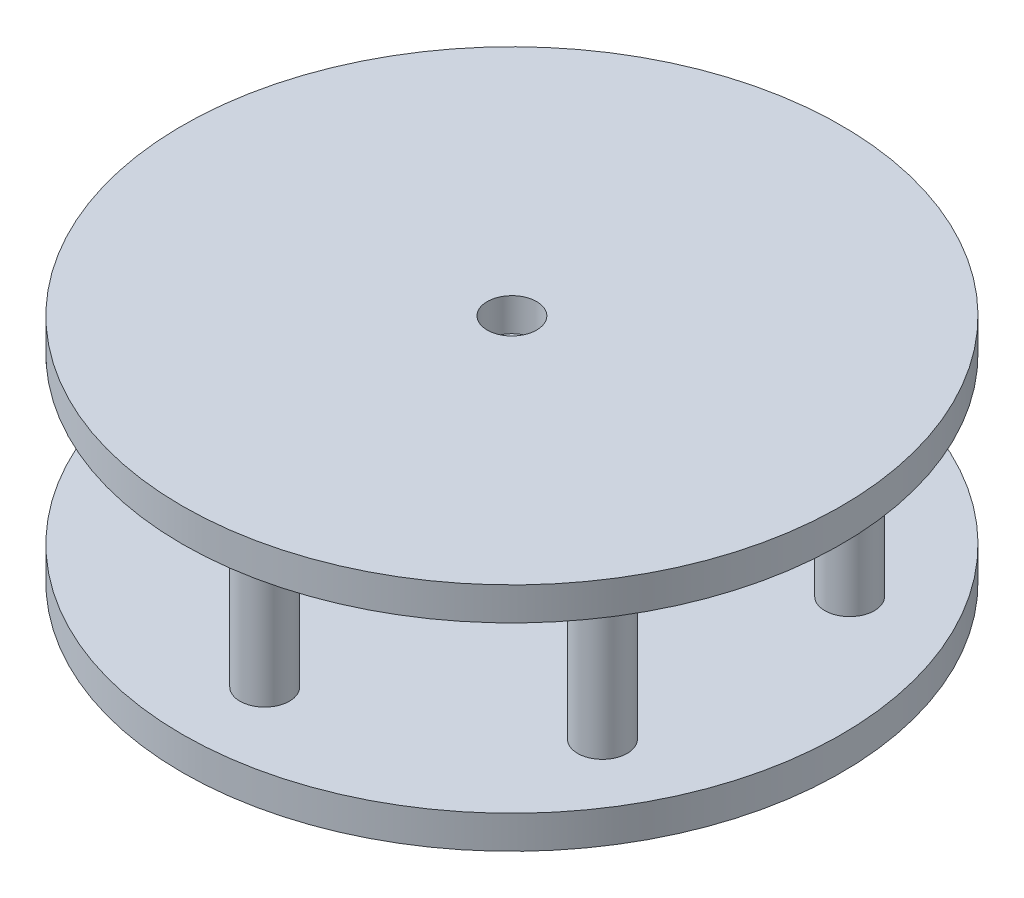
ISO-10303-21;
HEADER;
FILE_DESCRIPTION(('STEP AP214'),'2;1');
FILE_NAME('part.step','',(''),(''),'','','');
FILE_SCHEMA(('AUTOMOTIVE_DESIGN { 1 0 10303 214 1 1 1 1 }'));
ENDSEC;
DATA;
#1=APPLICATION_CONTEXT('core data for automotive mechanical design processes');
#2=APPLICATION_PROTOCOL_DEFINITION('international standard','automotive_design',2000,#1);
#3=PRODUCT_CONTEXT('',#1,'mechanical');
#4=PRODUCT('Part','Part','',(#3));
#5=PRODUCT_RELATED_PRODUCT_CATEGORY('part','',(#4));
#6=PRODUCT_DEFINITION_FORMATION('','',#4);
#7=PRODUCT_DEFINITION_CONTEXT('part definition',#1,'design');
#8=PRODUCT_DEFINITION('design','',#6,#7);
#9=PRODUCT_DEFINITION_SHAPE('','',#8);
#10=(LENGTH_UNIT() NAMED_UNIT(*) SI_UNIT(.MILLI.,.METRE.));
#11=(NAMED_UNIT(*) PLANE_ANGLE_UNIT() SI_UNIT($,.RADIAN.));
#12=(NAMED_UNIT(*) SI_UNIT($,.STERADIAN.) SOLID_ANGLE_UNIT());
#13=UNCERTAINTY_MEASURE_WITH_UNIT(LENGTH_MEASURE(1.E-05),#10,'distance_accuracy_value','');
#14=(GEOMETRIC_REPRESENTATION_CONTEXT(3) GLOBAL_UNCERTAINTY_ASSIGNED_CONTEXT((#13)) GLOBAL_UNIT_ASSIGNED_CONTEXT((#10,
#11,#12)) REPRESENTATION_CONTEXT('',''));
#15=CARTESIAN_POINT('',(0.,0.,0.));
#16=DIRECTION('',(0.,0.,1.));
#17=DIRECTION('',(1.,0.,0.));
#18=AXIS2_PLACEMENT_3D('',#15,#16,#17);
#19=CARTESIAN_POINT('',(0.,5.08000000000001,0.));
#20=DIRECTION('',(0.,-1.,0.));
#21=DIRECTION('',(0.,0.,-1.));
#22=AXIS2_PLACEMENT_3D('',#19,#20,#21);
#23=CYLINDRICAL_SURFACE('',#22,50.7895580678315);
#24=CARTESIAN_POINT('',(0.,5.08000000000001,0.));
#25=DIRECTION('',(0.,1.,0.));
#26=DIRECTION('',(0.,0.,1.));
#27=AXIS2_PLACEMENT_3D('',#24,#25,#26);
#28=CIRCLE('',#27,50.7895580678315);
#29=CARTESIAN_POINT('',(0.,5.08000000000001,50.7895580678315));
#30=VERTEX_POINT('',#29);
#31=EDGE_CURVE('E10',#30,#30,#28,.T.);
#32=ORIENTED_EDGE('',*,*,#31,.F.);
#33=EDGE_LOOP('',(#32));
#34=FACE_BOUND('',#33,.T.);
#35=CARTESIAN_POINT('',(0.,0.,0.));
#36=DIRECTION('',(0.,1.,0.));
#37=DIRECTION('',(0.,0.,1.));
#38=AXIS2_PLACEMENT_3D('',#35,#36,#37);
#39=CIRCLE('',#38,50.7895580678315);
#40=CARTESIAN_POINT('',(0.,0.,50.7895580678315));
#41=VERTEX_POINT('',#40);
#42=EDGE_CURVE('E40',#41,#41,#39,.T.);
#43=ORIENTED_EDGE('',*,*,#42,.T.);
#44=EDGE_LOOP('',(#43));
#45=FACE_BOUND('',#44,.T.);
#46=ADVANCED_FACE('F33',(#34,#45),#23,.T.);
#47=CARTESIAN_POINT('',(0.,5.08000000000001,0.));
#48=DIRECTION('',(0.,1.,0.));
#49=DIRECTION('',(0.,0.,1.));
#50=AXIS2_PLACEMENT_3D('',#47,#48,#49);
#51=PLANE('',#50);
#52=CARTESIAN_POINT('',(0.,5.08000000000001,0.));
#53=DIRECTION('',(0.,1.,0.));
#54=DIRECTION('',(0.,0.,1.));
#55=AXIS2_PLACEMENT_3D('',#52,#53,#54);
#56=CIRCLE('',#55,3.81);
#57=CARTESIAN_POINT('',(0.,5.08000000000001,3.81));
#58=VERTEX_POINT('',#57);
#59=EDGE_CURVE('E86',#58,#58,#56,.T.);
#60=ORIENTED_EDGE('',*,*,#59,.F.);
#61=EDGE_LOOP('',(#60));
#62=FACE_BOUND('',#61,.T.);
#63=CARTESIAN_POINT('',(32.995567884187,5.08000000000001,-19.0500000000003));
#64=DIRECTION('',(0.,1.,0.));
#65=DIRECTION('',(-0.866025403784435,0.,0.500000000000007));
#66=AXIS2_PLACEMENT_3D('',#63,#64,#65);
#67=CIRCLE('',#66,3.81373388663265);
#68=CARTESIAN_POINT('',(29.6927774550895,5.08000000000001,-17.1431330566839));
#69=VERTEX_POINT('',#68);
#70=EDGE_CURVE('E77',#69,#69,#67,.T.);
#71=ORIENTED_EDGE('',*,*,#70,.F.);
#72=EDGE_LOOP('',(#71));
#73=FACE_BOUND('',#72,.T.);
#74=CARTESIAN_POINT('',(32.9955678841872,5.08000000000001,19.0499999999998));
#75=DIRECTION('',(0.,1.,0.));
#76=DIRECTION('',(-0.866025403784442,0.,-0.499999999999994));
#77=AXIS2_PLACEMENT_3D('',#74,#75,#76);
#78=CIRCLE('',#77,3.81373388663265);
#79=CARTESIAN_POINT('',(29.6927774550898,5.08000000000001,17.1431330566835));
#80=VERTEX_POINT('',#79);
#81=EDGE_CURVE('E71',#80,#80,#78,.T.);
#82=ORIENTED_EDGE('',*,*,#81,.F.);
#83=EDGE_LOOP('',(#82));
#84=FACE_BOUND('',#83,.T.);
#85=CARTESIAN_POINT('',(1.98565732923109E-13,5.08000000000001,38.1));
#86=DIRECTION('',(0.,1.,0.));
#87=DIRECTION('',(0.,0.,-1.));
#88=AXIS2_PLACEMENT_3D('',#85,#86,#87);
#89=CIRCLE('',#88,3.81373388663265);
#90=CARTESIAN_POINT('',(1.78709123803299E-13,5.08000000000001,34.2862661133674));
#91=VERTEX_POINT('',#90);
#92=EDGE_CURVE('E65',#91,#91,#89,.T.);
#93=ORIENTED_EDGE('',*,*,#92,.F.);
#94=EDGE_LOOP('',(#93));
#95=FACE_BOUND('',#94,.T.);
#96=CARTESIAN_POINT('',(-32.9955678841871,5.08000000000001,19.0500000000001));
#97=DIRECTION('',(0.,1.,0.));
#98=DIRECTION('',(0.866025403784437,0.,-0.500000000000003));
#99=AXIS2_PLACEMENT_3D('',#96,#97,#98);
#100=CIRCLE('',#99,3.81373388663265);
#101=CARTESIAN_POINT('',(-29.6927774550896,5.08000000000001,17.1431330566838));
#102=VERTEX_POINT('',#101);
#103=EDGE_CURVE('E59',#102,#102,#100,.T.);
#104=ORIENTED_EDGE('',*,*,#103,.F.);
#105=EDGE_LOOP('',(#104));
#106=FACE_BOUND('',#105,.T.);
#107=CARTESIAN_POINT('',(-32.9955678841871,5.08000000000001,-19.0499999999999));
#108=DIRECTION('',(0.,1.,0.));
#109=DIRECTION('',(0.866025403784439,0.,0.499999999999999));
#110=AXIS2_PLACEMENT_3D('',#107,#108,#109);
#111=CIRCLE('',#110,3.81373388663265);
#112=CARTESIAN_POINT('',(-29.6927774550897,5.08000000000001,-17.1431330566836));
#113=VERTEX_POINT('',#112);
#114=EDGE_CURVE('E53',#113,#113,#111,.T.);
#115=ORIENTED_EDGE('',*,*,#114,.F.);
#116=EDGE_LOOP('',(#115));
#117=FACE_BOUND('',#116,.T.);
#118=CARTESIAN_POINT('',(0.,5.08000000000001,-38.1));
#119=DIRECTION('',(0.,1.,0.));
#120=DIRECTION('',(0.,0.,1.));
#121=AXIS2_PLACEMENT_3D('',#118,#119,#120);
#122=CIRCLE('',#121,3.81373388663265);
#123=CARTESIAN_POINT('',(0.,5.08000000000001,-34.2862661133674));
#124=VERTEX_POINT('',#123);
#125=EDGE_CURVE('E47',#124,#124,#122,.T.);
#126=ORIENTED_EDGE('',*,*,#125,.F.);
#127=EDGE_LOOP('',(#126));
#128=FACE_BOUND('',#127,.T.);
#129=ORIENTED_EDGE('',*,*,#31,.T.);
#130=EDGE_LOOP('',(#129));
#131=FACE_BOUND('',#130,.T.);
#132=ADVANCED_FACE('F118',(#62,#73,#84,#95,#106,#117,#128,#131),#51,.T.);
#133=CARTESIAN_POINT('',(0.,0.,0.));
#134=DIRECTION('',(0.,1.,0.));
#135=DIRECTION('',(0.,0.,1.));
#136=AXIS2_PLACEMENT_3D('',#133,#134,#135);
#137=PLANE('',#136);
#138=CARTESIAN_POINT('',(0.,0.,0.));
#139=DIRECTION('',(0.,1.,0.));
#140=DIRECTION('',(0.,0.,1.));
#141=AXIS2_PLACEMENT_3D('',#138,#139,#140);
#142=CIRCLE('',#141,3.81);
#143=CARTESIAN_POINT('',(0.,0.,3.81));
#144=VERTEX_POINT('',#143);
#145=EDGE_CURVE('E94',#144,#144,#142,.T.);
#146=ORIENTED_EDGE('',*,*,#145,.T.);
#147=EDGE_LOOP('',(#146));
#148=FACE_BOUND('',#147,.T.);
#149=ORIENTED_EDGE('',*,*,#42,.F.);
#150=EDGE_LOOP('',(#149));
#151=FACE_BOUND('',#150,.T.);
#152=ADVANCED_FACE('F123',(#148,#151),#137,.F.);
#153=CARTESIAN_POINT('',(0.,30.48,-38.1));
#154=DIRECTION('',(0.,-1.,0.));
#155=DIRECTION('',(0.,0.,-1.));
#156=AXIS2_PLACEMENT_3D('',#153,#154,#155);
#157=CYLINDRICAL_SURFACE('',#156,3.81373388663265);
#158=CARTESIAN_POINT('',(0.,30.48,-38.1));
#159=DIRECTION('',(0.,1.,0.));
#160=DIRECTION('',(0.,0.,1.));
#161=AXIS2_PLACEMENT_3D('',#158,#159,#160);
#162=CIRCLE('',#161,3.81373388663265);
#163=CARTESIAN_POINT('',(0.,30.48,-34.2862661133674));
#164=VERTEX_POINT('',#163);
#165=EDGE_CURVE('E45',#164,#164,#162,.T.);
#166=ORIENTED_EDGE('',*,*,#165,.F.);
#167=EDGE_LOOP('',(#166));
#168=FACE_BOUND('',#167,.T.);
#169=ORIENTED_EDGE('',*,*,#125,.T.);
#170=EDGE_LOOP('',(#169));
#171=FACE_BOUND('',#170,.T.);
#172=ADVANCED_FACE('F130',(#168,#171),#157,.T.);
#173=CARTESIAN_POINT('',(-32.9955678841871,30.48,-19.0499999999999));
#174=DIRECTION('',(0.,-1.,0.));
#175=DIRECTION('',(0.,0.,-1.));
#176=AXIS2_PLACEMENT_3D('',#173,#174,#175);
#177=CYLINDRICAL_SURFACE('',#176,3.81373388663265);
#178=CARTESIAN_POINT('',(-32.9955678841871,30.48,-19.0499999999999));
#179=DIRECTION('',(0.,1.,0.));
#180=DIRECTION('',(0.866025403784439,0.,0.499999999999999));
#181=AXIS2_PLACEMENT_3D('',#178,#179,#180);
#182=CIRCLE('',#181,3.81373388663265);
#183=CARTESIAN_POINT('',(-29.6927774550897,30.48,-17.1431330566836));
#184=VERTEX_POINT('',#183);
#185=EDGE_CURVE('E50',#184,#184,#182,.T.);
#186=ORIENTED_EDGE('',*,*,#185,.F.);
#187=EDGE_LOOP('',(#186));
#188=FACE_BOUND('',#187,.T.);
#189=ORIENTED_EDGE('',*,*,#114,.T.);
#190=EDGE_LOOP('',(#189));
#191=FACE_BOUND('',#190,.T.);
#192=ADVANCED_FACE('F134',(#188,#191),#177,.T.);
#193=CARTESIAN_POINT('',(-32.9955678841871,30.48,19.0500000000001));
#194=DIRECTION('',(0.,-1.,0.));
#195=DIRECTION('',(0.,0.,-1.));
#196=AXIS2_PLACEMENT_3D('',#193,#194,#195);
#197=CYLINDRICAL_SURFACE('',#196,3.81373388663265);
#198=CARTESIAN_POINT('',(-32.9955678841871,30.48,19.0500000000001));
#199=DIRECTION('',(0.,1.,0.));
#200=DIRECTION('',(0.866025403784437,0.,-0.500000000000003));
#201=AXIS2_PLACEMENT_3D('',#198,#199,#200);
#202=CIRCLE('',#201,3.81373388663265);
#203=CARTESIAN_POINT('',(-29.6927774550896,30.48,17.1431330566838));
#204=VERTEX_POINT('',#203);
#205=EDGE_CURVE('E56',#204,#204,#202,.T.);
#206=ORIENTED_EDGE('',*,*,#205,.F.);
#207=EDGE_LOOP('',(#206));
#208=FACE_BOUND('',#207,.T.);
#209=ORIENTED_EDGE('',*,*,#103,.T.);
#210=EDGE_LOOP('',(#209));
#211=FACE_BOUND('',#210,.T.);
#212=ADVANCED_FACE('F140',(#208,#211),#197,.T.);
#213=CARTESIAN_POINT('',(1.98565732923109E-13,30.48,38.1));
#214=DIRECTION('',(0.,-1.,0.));
#215=DIRECTION('',(0.,0.,-1.));
#216=AXIS2_PLACEMENT_3D('',#213,#214,#215);
#217=CYLINDRICAL_SURFACE('',#216,3.81373388663265);
#218=CARTESIAN_POINT('',(1.98565732923109E-13,30.48,38.1));
#219=DIRECTION('',(0.,1.,0.));
#220=DIRECTION('',(0.,0.,-1.));
#221=AXIS2_PLACEMENT_3D('',#218,#219,#220);
#222=CIRCLE('',#221,3.81373388663265);
#223=CARTESIAN_POINT('',(1.78709123803299E-13,30.48,34.2862661133674));
#224=VERTEX_POINT('',#223);
#225=EDGE_CURVE('E62',#224,#224,#222,.T.);
#226=ORIENTED_EDGE('',*,*,#225,.F.);
#227=EDGE_LOOP('',(#226));
#228=FACE_BOUND('',#227,.T.);
#229=ORIENTED_EDGE('',*,*,#92,.T.);
#230=EDGE_LOOP('',(#229));
#231=FACE_BOUND('',#230,.T.);
#232=ADVANCED_FACE('F144',(#228,#231),#217,.T.);
#233=CARTESIAN_POINT('',(32.9955678841872,30.48,19.0499999999998));
#234=DIRECTION('',(0.,-1.,0.));
#235=DIRECTION('',(0.,0.,-1.));
#236=AXIS2_PLACEMENT_3D('',#233,#234,#235);
#237=CYLINDRICAL_SURFACE('',#236,3.81373388663265);
#238=CARTESIAN_POINT('',(32.9955678841872,30.48,19.0499999999998));
#239=DIRECTION('',(0.,1.,0.));
#240=DIRECTION('',(-0.866025403784442,0.,-0.499999999999994));
#241=AXIS2_PLACEMENT_3D('',#238,#239,#240);
#242=CIRCLE('',#241,3.81373388663265);
#243=CARTESIAN_POINT('',(29.6927774550898,30.48,17.1431330566835));
#244=VERTEX_POINT('',#243);
#245=EDGE_CURVE('E68',#244,#244,#242,.T.);
#246=ORIENTED_EDGE('',*,*,#245,.F.);
#247=EDGE_LOOP('',(#246));
#248=FACE_BOUND('',#247,.T.);
#249=ORIENTED_EDGE('',*,*,#81,.T.);
#250=EDGE_LOOP('',(#249));
#251=FACE_BOUND('',#250,.T.);
#252=ADVANCED_FACE('F148',(#248,#251),#237,.T.);
#253=CARTESIAN_POINT('',(32.995567884187,30.48,-19.0500000000003));
#254=DIRECTION('',(0.,-1.,0.));
#255=DIRECTION('',(0.,0.,-1.));
#256=AXIS2_PLACEMENT_3D('',#253,#254,#255);
#257=CYLINDRICAL_SURFACE('',#256,3.81373388663265);
#258=CARTESIAN_POINT('',(32.995567884187,30.48,-19.0500000000003));
#259=DIRECTION('',(0.,1.,0.));
#260=DIRECTION('',(-0.866025403784435,0.,0.500000000000007));
#261=AXIS2_PLACEMENT_3D('',#258,#259,#260);
#262=CIRCLE('',#261,3.81373388663265);
#263=CARTESIAN_POINT('',(29.6927774550895,30.48,-17.1431330566839));
#264=VERTEX_POINT('',#263);
#265=EDGE_CURVE('E74',#264,#264,#262,.T.);
#266=ORIENTED_EDGE('',*,*,#265,.F.);
#267=EDGE_LOOP('',(#266));
#268=FACE_BOUND('',#267,.T.);
#269=ORIENTED_EDGE('',*,*,#70,.T.);
#270=EDGE_LOOP('',(#269));
#271=FACE_BOUND('',#270,.T.);
#272=ADVANCED_FACE('F152',(#268,#271),#257,.T.);
#273=CARTESIAN_POINT('',(0.,35.56,0.));
#274=DIRECTION('',(0.,-1.,0.));
#275=DIRECTION('',(0.,0.,-1.));
#276=AXIS2_PLACEMENT_3D('',#273,#274,#275);
#277=CYLINDRICAL_SURFACE('',#276,50.7895580678315);
#278=CARTESIAN_POINT('',(0.,35.56,0.));
#279=DIRECTION('',(0.,1.,0.));
#280=DIRECTION('',(0.,0.,1.));
#281=AXIS2_PLACEMENT_3D('',#278,#279,#280);
#282=CIRCLE('',#281,50.7895580678315);
#283=CARTESIAN_POINT('',(0.,35.56,50.7895580678315));
#284=VERTEX_POINT('',#283);
#285=EDGE_CURVE('E80',#284,#284,#282,.T.);
#286=ORIENTED_EDGE('',*,*,#285,.F.);
#287=EDGE_LOOP('',(#286));
#288=FACE_BOUND('',#287,.T.);
#289=CARTESIAN_POINT('',(0.,30.48,0.));
#290=DIRECTION('',(0.,1.,0.));
#291=DIRECTION('',(0.,0.,1.));
#292=AXIS2_PLACEMENT_3D('',#289,#290,#291);
#293=CIRCLE('',#292,50.7895580678315);
#294=CARTESIAN_POINT('',(0.,30.48,50.7895580678315));
#295=VERTEX_POINT('',#294);
#296=EDGE_CURVE('E83',#295,#295,#293,.T.);
#297=ORIENTED_EDGE('',*,*,#296,.T.);
#298=EDGE_LOOP('',(#297));
#299=FACE_BOUND('',#298,.T.);
#300=ADVANCED_FACE('F156',(#288,#299),#277,.T.);
#301=CARTESIAN_POINT('',(0.,35.56,0.));
#302=DIRECTION('',(0.,1.,0.));
#303=DIRECTION('',(0.,0.,1.));
#304=AXIS2_PLACEMENT_3D('',#301,#302,#303);
#305=PLANE('',#304);
#306=CARTESIAN_POINT('',(0.,35.56,0.));
#307=DIRECTION('',(0.,1.,0.));
#308=DIRECTION('',(0.,0.,1.));
#309=AXIS2_PLACEMENT_3D('',#306,#307,#308);
#310=CIRCLE('',#309,3.81);
#311=CARTESIAN_POINT('',(0.,35.56,3.81));
#312=VERTEX_POINT('',#311);
#313=EDGE_CURVE('E91',#312,#312,#310,.T.);
#314=ORIENTED_EDGE('',*,*,#313,.F.);
#315=EDGE_LOOP('',(#314));
#316=FACE_BOUND('',#315,.T.);
#317=ORIENTED_EDGE('',*,*,#285,.T.);
#318=EDGE_LOOP('',(#317));
#319=FACE_BOUND('',#318,.T.);
#320=ADVANCED_FACE('F114',(#316,#319),#305,.T.);
#321=CARTESIAN_POINT('',(0.,30.48,0.));
#322=DIRECTION('',(0.,1.,0.));
#323=DIRECTION('',(0.,0.,1.));
#324=AXIS2_PLACEMENT_3D('',#321,#322,#323);
#325=PLANE('',#324);
#326=CARTESIAN_POINT('',(0.,30.48,0.));
#327=DIRECTION('',(0.,1.,0.));
#328=DIRECTION('',(0.,0.,1.));
#329=AXIS2_PLACEMENT_3D('',#326,#327,#328);
#330=CIRCLE('',#329,3.81);
#331=CARTESIAN_POINT('',(0.,30.48,3.81));
#332=VERTEX_POINT('',#331);
#333=EDGE_CURVE('E36',#332,#332,#330,.T.);
#334=ORIENTED_EDGE('',*,*,#333,.T.);
#335=EDGE_LOOP('',(#334));
#336=FACE_BOUND('',#335,.T.);
#337=ORIENTED_EDGE('',*,*,#165,.T.);
#338=EDGE_LOOP('',(#337));
#339=FACE_BOUND('',#338,.T.);
#340=ORIENTED_EDGE('',*,*,#185,.T.);
#341=EDGE_LOOP('',(#340));
#342=FACE_BOUND('',#341,.T.);
#343=ORIENTED_EDGE('',*,*,#205,.T.);
#344=EDGE_LOOP('',(#343));
#345=FACE_BOUND('',#344,.T.);
#346=ORIENTED_EDGE('',*,*,#225,.T.);
#347=EDGE_LOOP('',(#346));
#348=FACE_BOUND('',#347,.T.);
#349=ORIENTED_EDGE('',*,*,#245,.T.);
#350=EDGE_LOOP('',(#349));
#351=FACE_BOUND('',#350,.T.);
#352=ORIENTED_EDGE('',*,*,#265,.T.);
#353=EDGE_LOOP('',(#352));
#354=FACE_BOUND('',#353,.T.);
#355=ORIENTED_EDGE('',*,*,#296,.F.);
#356=EDGE_LOOP('',(#355));
#357=FACE_BOUND('',#356,.T.);
#358=ADVANCED_FACE('F101',(#336,#339,#342,#345,#348,#351,#354,#357),#325,.F.);
#359=CARTESIAN_POINT('',(0.,0.,0.));
#360=DIRECTION('',(0.,1.,0.));
#361=DIRECTION('',(0.,0.,1.));
#362=AXIS2_PLACEMENT_3D('',#359,#360,#361);
#363=CYLINDRICAL_SURFACE('',#362,3.81);
#364=ORIENTED_EDGE('',*,*,#313,.T.);
#365=EDGE_LOOP('',(#364));
#366=FACE_BOUND('',#365,.T.);
#367=ORIENTED_EDGE('',*,*,#333,.F.);
#368=EDGE_LOOP('',(#367));
#369=FACE_BOUND('',#368,.T.);
#370=ADVANCED_FACE('F104',(#366,#369),#363,.F.);
#371=ORIENTED_EDGE('',*,*,#59,.T.);
#372=EDGE_LOOP('',(#371));
#373=FACE_BOUND('',#372,.T.);
#374=ORIENTED_EDGE('',*,*,#145,.F.);
#375=EDGE_LOOP('',(#374));
#376=FACE_BOUND('',#375,.T.);
#377=ADVANCED_FACE('F106',(#373,#376),#363,.F.);
#378=CLOSED_SHELL('',(#46,#132,#152,#172,#192,#212,#232,#252,#272,#300,#320,#358,#370,#377));
#379=MANIFOLD_SOLID_BREP('B2',#378);
#380=ADVANCED_BREP_SHAPE_REPRESENTATION('',(#18,#379),#14);
#381=SHAPE_DEFINITION_REPRESENTATION(#9,#380);
ENDSEC;
END-ISO-10303-21;
